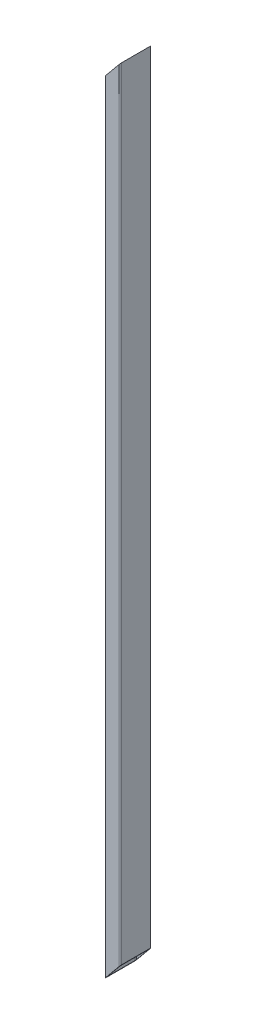
ISO-10303-21;
HEADER;
FILE_DESCRIPTION(('STEP AP214'),'2;1');
FILE_NAME('part.step','',(''),(''),'','','');
FILE_SCHEMA(('AUTOMOTIVE_DESIGN { 1 0 10303 214 1 1 1 1 }'));
ENDSEC;
DATA;
#1=APPLICATION_CONTEXT('core data for automotive mechanical design processes');
#2=APPLICATION_PROTOCOL_DEFINITION('international standard','automotive_design',2000,#1);
#3=PRODUCT_CONTEXT('',#1,'mechanical');
#4=PRODUCT('Part','Part','',(#3));
#5=PRODUCT_RELATED_PRODUCT_CATEGORY('part','',(#4));
#6=PRODUCT_DEFINITION_FORMATION('','',#4);
#7=PRODUCT_DEFINITION_CONTEXT('part definition',#1,'design');
#8=PRODUCT_DEFINITION('design','',#6,#7);
#9=PRODUCT_DEFINITION_SHAPE('','',#8);
#10=(LENGTH_UNIT() NAMED_UNIT(*) SI_UNIT(.MILLI.,.METRE.));
#11=(NAMED_UNIT(*) PLANE_ANGLE_UNIT() SI_UNIT($,.RADIAN.));
#12=(NAMED_UNIT(*) SI_UNIT($,.STERADIAN.) SOLID_ANGLE_UNIT());
#13=UNCERTAINTY_MEASURE_WITH_UNIT(LENGTH_MEASURE(1.E-05),#10,'distance_accuracy_value','');
#14=(GEOMETRIC_REPRESENTATION_CONTEXT(3) GLOBAL_UNCERTAINTY_ASSIGNED_CONTEXT((#13)) GLOBAL_UNIT_ASSIGNED_CONTEXT((#10,
#11,#12)) REPRESENTATION_CONTEXT('',''));
#15=CARTESIAN_POINT('',(0.,0.,0.));
#16=DIRECTION('',(0.,0.,1.));
#17=DIRECTION('',(1.,0.,0.));
#18=AXIS2_PLACEMENT_3D('',#15,#16,#17);
#19=CARTESIAN_POINT('',(-19.5606601717798,1198.48759471742,0.439339828217511));
#20=DIRECTION('',(0.771561366113838,-0.636154901199816,0.));
#21=DIRECTION('',(0.636154901199816,0.771561366113838,0.));
#22=AXIS2_PLACEMENT_3D('',#19,#20,#21);
#23=PLANE('',#22);
#24=CARTESIAN_POINT('',(-18.5,1199.77401789765,-2.66496893996937E-12));
#25=CARTESIAN_POINT('',(-19.3786796564404,1198.70831004125,-2.66981289665576E-12));
#26=CARTESIAN_POINT('',(-20.,1197.95474078922,0.621320343556975));
#27=CARTESIAN_POINT('',(-20.,1197.95474078922,1.49999999999734));
#28=(BOUNDED_CURVE() B_SPLINE_CURVE(3,(#24,#25,#26,#27),.UNSPECIFIED.,.F.,
.F.) B_SPLINE_CURVE_WITH_KNOTS((4,4),(0.,1.),
.UNSPECIFIED.) CURVE() GEOMETRIC_REPRESENTATION_ITEM() RATIONAL_B_SPLINE_CURVE((1.,
0.804737854124364,0.804737854124364,1.)) REPRESENTATION_ITEM(''));
#29=CARTESIAN_POINT('',(-18.4999999999298,1199.77401789759,-2.66270419889708E-12));
#30=VERTEX_POINT('',#29);
#31=CARTESIAN_POINT('',(-20.,1197.95474078907,1.49999999999734));
#32=VERTEX_POINT('',#31);
#33=EDGE_CURVE('E249',#30,#32,#28,.T.);
#34=ORIENTED_EDGE('',*,*,#33,.T.);
#35=DIRECTION('',(0.,0.,-1.));
#36=VECTOR('',#35,1.);
#37=CARTESIAN_POINT('',(-20.,1197.95474078907,-57.9999999999982));
#38=LINE('',#37,#36);
#39=CARTESIAN_POINT('',(-20.,1197.95474078922,38.4999999999973));
#40=VERTEX_POINT('',#39);
#41=EDGE_CURVE('E253',#40,#32,#38,.T.);
#42=ORIENTED_EDGE('',*,*,#41,.F.);
#43=CARTESIAN_POINT('',(-20.,1197.95474078922,38.4999999999973));
#44=CARTESIAN_POINT('',(-20.,1197.95474078922,39.3786796564377));
#45=CARTESIAN_POINT('',(-19.3786796564403,1198.70831004125,39.9999999999973));
#46=CARTESIAN_POINT('',(-18.5,1199.77401789765,39.9999999999973));
#47=(BOUNDED_CURVE() B_SPLINE_CURVE(3,(#43,#44,#45,#46),.UNSPECIFIED.,.F.,
.F.) B_SPLINE_CURVE_WITH_KNOTS((4,4),(0.,1.),
.UNSPECIFIED.) CURVE() GEOMETRIC_REPRESENTATION_ITEM() RATIONAL_B_SPLINE_CURVE((1.,
0.804737854124364,0.804737854124364,1.)) REPRESENTATION_ITEM(''));
#48=CARTESIAN_POINT('',(-18.4999999999298,1199.77401789759,39.9999999999973));
#49=VERTEX_POINT('',#48);
#50=EDGE_CURVE('E260',#40,#49,#47,.T.);
#51=ORIENTED_EDGE('',*,*,#50,.T.);
#52=DIRECTION('',(-0.636154901199819,-0.771561366113836,0.));
#53=VECTOR('',#52,1.);
#54=CARTESIAN_POINT('',(2380.74301047747,4109.69927558504,39.9999999999964));
#55=LINE('',#54,#53);
#56=CARTESIAN_POINT('',(-1.49999999999998,1220.39249179318,39.9999999999973));
#57=VERTEX_POINT('',#56);
#58=EDGE_CURVE('E264',#57,#49,#55,.T.);
#59=ORIENTED_EDGE('',*,*,#58,.F.);
#60=CARTESIAN_POINT('',(-1.49999999999998,1220.39249179318,39.9999999999973));
#61=CARTESIAN_POINT('',(-0.621320343559615,1221.45819964958,39.9999999999973));
#62=CARTESIAN_POINT('',(0.,1222.21176890161,39.3786796564377));
#63=CARTESIAN_POINT('',(0.,1222.21176890161,38.4999999999973));
#64=(BOUNDED_CURVE() B_SPLINE_CURVE(3,(#60,#61,#62,#63),.UNSPECIFIED.,.F.,
.F.) B_SPLINE_CURVE_WITH_KNOTS((4,4),(0.,1.),
.UNSPECIFIED.) CURVE() GEOMETRIC_REPRESENTATION_ITEM() RATIONAL_B_SPLINE_CURVE((1.,
0.804737854124365,0.804737854124365,1.)) REPRESENTATION_ITEM(''));
#65=CARTESIAN_POINT('',(0.,1222.21176890152,38.4999999999973));
#66=VERTEX_POINT('',#65);
#67=EDGE_CURVE('E270',#57,#66,#64,.T.);
#68=ORIENTED_EDGE('',*,*,#67,.T.);
#69=DIRECTION('',(0.,0.,1.));
#70=VECTOR('',#69,1.);
#71=CARTESIAN_POINT('',(0.,1222.21176890152,-57.9999999999977));
#72=LINE('',#71,#70);
#73=CARTESIAN_POINT('',(0.,1222.21176890161,1.49999999999732));
#74=VERTEX_POINT('',#73);
#75=EDGE_CURVE('E274',#74,#66,#72,.T.);
#76=ORIENTED_EDGE('',*,*,#75,.F.);
#77=CARTESIAN_POINT('',(0.,1222.21176890161,1.49999999999732));
#78=CARTESIAN_POINT('',(0.,1222.21176890161,0.621320343556965));
#79=CARTESIAN_POINT('',(-0.621320343559643,1221.45819964958,-2.67868531694287E-12));
#80=CARTESIAN_POINT('',(-1.5,1220.39249179318,-2.67884672777718E-12));
#81=(BOUNDED_CURVE() B_SPLINE_CURVE(3,(#77,#78,#79,#80),.UNSPECIFIED.,.F.,
.F.) B_SPLINE_CURVE_WITH_KNOTS((4,4),(0.,1.),
.UNSPECIFIED.) CURVE() GEOMETRIC_REPRESENTATION_ITEM() RATIONAL_B_SPLINE_CURVE((1.,
0.804737854124365,0.804737854124365,1.)) REPRESENTATION_ITEM(''));
#82=CARTESIAN_POINT('',(-1.49999999995831,1220.39249179314,-2.67658198670487E-12));
#83=VERTEX_POINT('',#82);
#84=EDGE_CURVE('E280',#74,#83,#81,.T.);
#85=ORIENTED_EDGE('',*,*,#84,.T.);
#86=DIRECTION('',(0.636154901199819,0.771561366113836,0.));
#87=VECTOR('',#86,1.);
#88=CARTESIAN_POINT('',(2380.74301047747,4109.69927558504,-4.62130334000221E-12));
#89=LINE('',#88,#87);
#90=EDGE_CURVE('E284',#30,#83,#89,.T.);
#91=ORIENTED_EDGE('',*,*,#90,.F.);
#92=EDGE_LOOP('',(#34,#42,#51,#59,#68,#76,#85,#91));
#93=FACE_BOUND('',#92,.T.);
#94=CARTESIAN_POINT('',(-1.5,1220.39249179306,2.49999999999732));
#95=CARTESIAN_POINT('',(-1.5,1220.39249179306,1.91421356237042));
#96=CARTESIAN_POINT('',(-1.9142135623731,1219.89011229171,1.49999999999733));
#97=CARTESIAN_POINT('',(-2.5,1219.17964038744,1.49999999999733));
#98=(BOUNDED_CURVE() B_SPLINE_CURVE(3,(#94,#95,#96,#97),.UNSPECIFIED.,.F.,
.F.) B_SPLINE_CURVE_WITH_KNOTS((4,4),(0.,1.),
.UNSPECIFIED.) CURVE() GEOMETRIC_REPRESENTATION_ITEM() RATIONAL_B_SPLINE_CURVE((1.,
0.804737854124365,0.804737854124365,1.)) REPRESENTATION_ITEM(''));
#99=CARTESIAN_POINT('',(-1.5,1220.39249179309,2.49999999999732));
#100=VERTEX_POINT('',#99);
#101=CARTESIAN_POINT('',(-2.50000000001549,1219.17964038745,1.49999999999732));
#102=VERTEX_POINT('',#101);
#103=EDGE_CURVE('E146',#100,#102,#98,.T.);
#104=ORIENTED_EDGE('',*,*,#103,.F.);
#105=DIRECTION('',(0.,0.,1.));
#106=VECTOR('',#105,1.);
#107=CARTESIAN_POINT('',(-1.50000000000006,1220.39249179309,-57.9999999999974));
#108=LINE('',#107,#106);
#109=CARTESIAN_POINT('',(-1.49999999999997,1220.39249179324,37.4999999999973));
#110=VERTEX_POINT('',#109);
#111=EDGE_CURVE('E195',#100,#110,#108,.T.);
#112=ORIENTED_EDGE('',*,*,#111,.T.);
#113=CARTESIAN_POINT('',(-2.49999999999998,1219.17964038744,38.4999999999973));
#114=CARTESIAN_POINT('',(-1.91421356237307,1219.89011229171,38.4999999999973));
#115=CARTESIAN_POINT('',(-1.49999999999998,1220.39249179306,38.0857864376242));
#116=CARTESIAN_POINT('',(-1.49999999999998,1220.39249179306,37.4999999999973));
#117=(BOUNDED_CURVE() B_SPLINE_CURVE(3,(#113,#114,#115,#116),.UNSPECIFIED.,.F.,
.F.) B_SPLINE_CURVE_WITH_KNOTS((4,4),(0.,1.),
.UNSPECIFIED.) CURVE() GEOMETRIC_REPRESENTATION_ITEM() RATIONAL_B_SPLINE_CURVE((1.,
0.804737854124365,0.804737854124365,1.)) REPRESENTATION_ITEM(''));
#118=CARTESIAN_POINT('',(-2.49999999999998,1219.17964038744,38.4999999999973));
#119=VERTEX_POINT('',#118);
#120=EDGE_CURVE('E191',#119,#110,#117,.T.);
#121=ORIENTED_EDGE('',*,*,#120,.F.);
#122=DIRECTION('',(-0.636154901199819,-0.771561366113836,0.));
#123=VECTOR('',#122,1.);
#124=CARTESIAN_POINT('',(2380.74301047747,4109.69927558504,38.4999999999951));
#125=LINE('',#124,#123);
#126=CARTESIAN_POINT('',(-17.4999999999841,1200.98686930315,38.4999999999973));
#127=VERTEX_POINT('',#126);
#128=EDGE_CURVE('E185',#119,#127,#125,.T.);
#129=ORIENTED_EDGE('',*,*,#128,.T.);
#130=CARTESIAN_POINT('',(-18.5,1199.77401789754,37.4999999999973));
#131=CARTESIAN_POINT('',(-18.5,1199.77401789754,38.0857864376242));
#132=CARTESIAN_POINT('',(-18.0857864376269,1200.27639739889,38.4999999999973));
#133=CARTESIAN_POINT('',(-17.5,1200.98686930316,38.4999999999973));
#134=(BOUNDED_CURVE() B_SPLINE_CURVE(3,(#130,#131,#132,#133),.UNSPECIFIED.,.F.,
.F.) B_SPLINE_CURVE_WITH_KNOTS((4,4),(0.,1.),
.UNSPECIFIED.) CURVE() GEOMETRIC_REPRESENTATION_ITEM() RATIONAL_B_SPLINE_CURVE((1.,
0.804737854124365,0.804737854124365,1.)) REPRESENTATION_ITEM(''));
#135=CARTESIAN_POINT('',(-18.5,1199.77401789754,37.4999999999973));
#136=VERTEX_POINT('',#135);
#137=EDGE_CURVE('E181',#136,#127,#134,.T.);
#138=ORIENTED_EDGE('',*,*,#137,.F.);
#139=DIRECTION('',(0.,0.,-1.));
#140=VECTOR('',#139,1.);
#141=CARTESIAN_POINT('',(-18.5,1199.77401789751,-57.9999999999986));
#142=LINE('',#141,#140);
#143=CARTESIAN_POINT('',(-18.4999999999999,1199.77401789751,2.49999999999734));
#144=VERTEX_POINT('',#143);
#145=EDGE_CURVE('E170',#136,#144,#142,.T.);
#146=ORIENTED_EDGE('',*,*,#145,.T.);
#147=CARTESIAN_POINT('',(-17.5,1200.98686930316,1.49999999999734));
#148=CARTESIAN_POINT('',(-18.0857864376269,1200.27639739889,1.49999999999734));
#149=CARTESIAN_POINT('',(-18.5,1199.77401789754,1.91421356237044));
#150=CARTESIAN_POINT('',(-18.5,1199.77401789754,2.49999999999734));
#151=(BOUNDED_CURVE() B_SPLINE_CURVE(3,(#147,#148,#149,#150),.UNSPECIFIED.,.F.,
.F.) B_SPLINE_CURVE_WITH_KNOTS((4,4),(0.,1.),
.UNSPECIFIED.) CURVE() GEOMETRIC_REPRESENTATION_ITEM() RATIONAL_B_SPLINE_CURVE((1.,
0.804737854124365,0.804737854124365,1.)) REPRESENTATION_ITEM(''));
#152=CARTESIAN_POINT('',(-17.5,1200.98686930316,1.49999999999734));
#153=VERTEX_POINT('',#152);
#154=EDGE_CURVE('E168',#153,#144,#151,.T.);
#155=ORIENTED_EDGE('',*,*,#154,.F.);
#156=DIRECTION('',(0.636154901199819,0.771561366113836,0.));
#157=VECTOR('',#156,1.);
#158=CARTESIAN_POINT('',(2380.74301047747,4109.69927558504,1.49999999999291));
#159=LINE('',#158,#157);
#160=EDGE_CURVE('E155',#153,#102,#159,.T.);
#161=ORIENTED_EDGE('',*,*,#160,.T.);
#162=EDGE_LOOP('',(#104,#112,#121,#129,#138,#146,#155,#161));
#163=FACE_BOUND('',#162,.T.);
#164=ADVANCED_FACE('F35',(#93,#163),#23,.F.);
#165=CARTESIAN_POINT('',(-19.5606601717798,198.487594717422,0.439339828217511));
#166=DIRECTION('',(0.771561366113838,-0.636154901199816,0.));
#167=DIRECTION('',(0.636154901199816,0.771561366113838,0.));
#168=AXIS2_PLACEMENT_3D('',#165,#166,#167);
#169=PLANE('',#168);
#170=CARTESIAN_POINT('',(-18.5,199.774017897653,-2.66496893996937E-12));
#171=CARTESIAN_POINT('',(-19.3786796564404,198.708310041247,-2.66981289665576E-12));
#172=CARTESIAN_POINT('',(-20.,197.954740789219,0.621320343556975));
#173=CARTESIAN_POINT('',(-20.,197.954740789219,1.49999999999734));
#174=(BOUNDED_CURVE() B_SPLINE_CURVE(3,(#170,#171,#172,#173),.UNSPECIFIED.,.F.,
.F.) B_SPLINE_CURVE_WITH_KNOTS((4,4),(0.,1.),
.UNSPECIFIED.) CURVE() GEOMETRIC_REPRESENTATION_ITEM() RATIONAL_B_SPLINE_CURVE((1.,
0.804737854124364,0.804737854124364,1.)) REPRESENTATION_ITEM(''));
#175=CARTESIAN_POINT('',(-18.4999999999298,199.774017897593,-2.66270419889708E-12));
#176=VERTEX_POINT('',#175);
#177=CARTESIAN_POINT('',(-20.,197.954740789075,1.49999999999734));
#178=VERTEX_POINT('',#177);
#179=EDGE_CURVE('E164',#176,#178,#174,.T.);
#180=ORIENTED_EDGE('',*,*,#179,.F.);
#181=DIRECTION('',(0.636154901199819,0.771561366113836,0.));
#182=VECTOR('',#181,1.);
#183=CARTESIAN_POINT('',(2380.74301047747,3109.69927558504,-4.62130334000221E-12));
#184=LINE('',#183,#182);
#185=CARTESIAN_POINT('',(-1.49999999995831,220.392491793141,-2.67658198670487E-12));
#186=VERTEX_POINT('',#185);
#187=EDGE_CURVE('E254',#176,#186,#184,.T.);
#188=ORIENTED_EDGE('',*,*,#187,.T.);
#189=CARTESIAN_POINT('',(0.,222.211768901611,1.49999999999732));
#190=CARTESIAN_POINT('',(0.,222.211768901611,0.621320343556965));
#191=CARTESIAN_POINT('',(-0.621320343559643,221.458199649583,-2.67868531694287E-12));
#192=CARTESIAN_POINT('',(-1.5,220.392491793177,-2.67884672777718E-12));
#193=(BOUNDED_CURVE() B_SPLINE_CURVE(3,(#189,#190,#191,#192),.UNSPECIFIED.,.F.,
.F.) B_SPLINE_CURVE_WITH_KNOTS((4,4),(0.,1.),
.UNSPECIFIED.) CURVE() GEOMETRIC_REPRESENTATION_ITEM() RATIONAL_B_SPLINE_CURVE((1.,
0.804737854124365,0.804737854124365,1.)) REPRESENTATION_ITEM(''));
#194=CARTESIAN_POINT('',(0.,222.211768901611,1.49999999999732));
#195=VERTEX_POINT('',#194);
#196=EDGE_CURVE('E323',#195,#186,#193,.T.);
#197=ORIENTED_EDGE('',*,*,#196,.F.);
#198=DIRECTION('',(0.,0.,1.));
#199=VECTOR('',#198,1.);
#200=CARTESIAN_POINT('',(0.,222.211768901524,-57.9999999999977));
#201=LINE('',#200,#199);
#202=CARTESIAN_POINT('',(0.,222.211768901524,38.4999999999973));
#203=VERTEX_POINT('',#202);
#204=EDGE_CURVE('E317',#195,#203,#201,.T.);
#205=ORIENTED_EDGE('',*,*,#204,.T.);
#206=CARTESIAN_POINT('',(-1.49999999999998,220.392491793177,39.9999999999973));
#207=CARTESIAN_POINT('',(-0.621320343559615,221.458199649583,39.9999999999973));
#208=CARTESIAN_POINT('',(0.,222.211768901611,39.3786796564377));
#209=CARTESIAN_POINT('',(0.,222.211768901611,38.4999999999973));
#210=(BOUNDED_CURVE() B_SPLINE_CURVE(3,(#206,#207,#208,#209),.UNSPECIFIED.,.F.,
.F.) B_SPLINE_CURVE_WITH_KNOTS((4,4),(0.,1.),
.UNSPECIFIED.) CURVE() GEOMETRIC_REPRESENTATION_ITEM() RATIONAL_B_SPLINE_CURVE((1.,
0.804737854124365,0.804737854124365,1.)) REPRESENTATION_ITEM(''));
#211=CARTESIAN_POINT('',(-1.49999999999998,220.392491793177,39.9999999999973));
#212=VERTEX_POINT('',#211);
#213=EDGE_CURVE('E312',#212,#203,#210,.T.);
#214=ORIENTED_EDGE('',*,*,#213,.F.);
#215=DIRECTION('',(-0.636154901199819,-0.771561366113836,0.));
#216=VECTOR('',#215,1.);
#217=CARTESIAN_POINT('',(2380.74301047747,3109.69927558504,39.9999999999964));
#218=LINE('',#217,#216);
#219=CARTESIAN_POINT('',(-18.4999999999298,199.774017897593,39.9999999999973));
#220=VERTEX_POINT('',#219);
#221=EDGE_CURVE('E306',#212,#220,#218,.T.);
#222=ORIENTED_EDGE('',*,*,#221,.T.);
#223=CARTESIAN_POINT('',(-20.,197.954740789219,38.4999999999973));
#224=CARTESIAN_POINT('',(-20.,197.954740789219,39.3786796564377));
#225=CARTESIAN_POINT('',(-19.3786796564403,198.708310041247,39.9999999999973));
#226=CARTESIAN_POINT('',(-18.5,199.774017897653,39.9999999999973));
#227=(BOUNDED_CURVE() B_SPLINE_CURVE(3,(#223,#224,#225,#226),.UNSPECIFIED.,.F.,
.F.) B_SPLINE_CURVE_WITH_KNOTS((4,4),(0.,1.),
.UNSPECIFIED.) CURVE() GEOMETRIC_REPRESENTATION_ITEM() RATIONAL_B_SPLINE_CURVE((1.,
0.804737854124364,0.804737854124364,1.)) REPRESENTATION_ITEM(''));
#228=CARTESIAN_POINT('',(-20.,197.954740789219,38.4999999999973));
#229=VERTEX_POINT('',#228);
#230=EDGE_CURVE('E301',#229,#220,#227,.T.);
#231=ORIENTED_EDGE('',*,*,#230,.F.);
#232=DIRECTION('',(0.,0.,-1.));
#233=VECTOR('',#232,1.);
#234=CARTESIAN_POINT('',(-20.,197.954740789075,-57.9999999999982));
#235=LINE('',#234,#233);
#236=EDGE_CURVE('E295',#229,#178,#235,.T.);
#237=ORIENTED_EDGE('',*,*,#236,.T.);
#238=EDGE_LOOP('',(#180,#188,#197,#205,#214,#222,#231,#237));
#239=FACE_BOUND('',#238,.T.);
#240=DIRECTION('',(0.,0.,1.));
#241=VECTOR('',#240,1.);
#242=CARTESIAN_POINT('',(-1.50000000000006,220.392491793091,-57.9999999999974));
#243=LINE('',#242,#241);
#244=CARTESIAN_POINT('',(-1.5,220.392491793235,2.49999999999732));
#245=VERTEX_POINT('',#244);
#246=CARTESIAN_POINT('',(-1.49999999999997,220.392491793091,37.4999999999973));
#247=VERTEX_POINT('',#246);
#248=EDGE_CURVE('E156',#245,#247,#243,.T.);
#249=ORIENTED_EDGE('',*,*,#248,.F.);
#250=CARTESIAN_POINT('',(-1.5,220.39249179306,2.49999999999732));
#251=CARTESIAN_POINT('',(-1.5,220.39249179306,1.91421356237042));
#252=CARTESIAN_POINT('',(-1.9142135623731,219.890112291708,1.49999999999733));
#253=CARTESIAN_POINT('',(-2.5,219.179640387438,1.49999999999733));
#254=(BOUNDED_CURVE() B_SPLINE_CURVE(3,(#250,#251,#252,#253),.UNSPECIFIED.,.F.,
.F.) B_SPLINE_CURVE_WITH_KNOTS((4,4),(0.,1.),
.UNSPECIFIED.) CURVE() GEOMETRIC_REPRESENTATION_ITEM() RATIONAL_B_SPLINE_CURVE((1.,
0.804737854124365,0.804737854124365,1.)) REPRESENTATION_ITEM(''));
#255=CARTESIAN_POINT('',(-2.50000000001549,219.17964038745,1.49999999999732));
#256=VERTEX_POINT('',#255);
#257=EDGE_CURVE('E58',#245,#256,#254,.T.);
#258=ORIENTED_EDGE('',*,*,#257,.T.);
#259=DIRECTION('',(0.636154901199819,0.771561366113836,0.));
#260=VECTOR('',#259,1.);
#261=CARTESIAN_POINT('',(2380.74301047747,3109.69927558504,1.49999999999291));
#262=LINE('',#261,#260);
#263=CARTESIAN_POINT('',(-17.5,200.986869303165,1.49999999999734));
#264=VERTEX_POINT('',#263);
#265=EDGE_CURVE('E163',#264,#256,#262,.T.);
#266=ORIENTED_EDGE('',*,*,#265,.F.);
#267=CARTESIAN_POINT('',(-17.5,200.986869303165,1.49999999999734));
#268=CARTESIAN_POINT('',(-18.0857864376269,200.276397398895,1.49999999999734));
#269=CARTESIAN_POINT('',(-18.5,199.774017897542,1.91421356237044));
#270=CARTESIAN_POINT('',(-18.5,199.774017897542,2.49999999999734));
#271=(BOUNDED_CURVE() B_SPLINE_CURVE(3,(#267,#268,#269,#270),.UNSPECIFIED.,.F.,
.F.) B_SPLINE_CURVE_WITH_KNOTS((4,4),(0.,1.),
.UNSPECIFIED.) CURVE() GEOMETRIC_REPRESENTATION_ITEM() RATIONAL_B_SPLINE_CURVE((1.,
0.804737854124365,0.804737854124365,1.)) REPRESENTATION_ITEM(''));
#272=CARTESIAN_POINT('',(-18.4999999999999,199.774017897509,2.49999999999734));
#273=VERTEX_POINT('',#272);
#274=EDGE_CURVE('E207',#264,#273,#271,.T.);
#275=ORIENTED_EDGE('',*,*,#274,.T.);
#276=DIRECTION('',(0.,0.,-1.));
#277=VECTOR('',#276,1.);
#278=CARTESIAN_POINT('',(-18.5,199.774017897508,-57.9999999999986));
#279=LINE('',#278,#277);
#280=CARTESIAN_POINT('',(-18.5,199.774017897542,37.4999999999973));
#281=VERTEX_POINT('',#280);
#282=EDGE_CURVE('E212',#281,#273,#279,.T.);
#283=ORIENTED_EDGE('',*,*,#282,.F.);
#284=CARTESIAN_POINT('',(-18.5,199.774017897542,37.4999999999973));
#285=CARTESIAN_POINT('',(-18.5,199.774017897542,38.0857864376242));
#286=CARTESIAN_POINT('',(-18.0857864376269,200.276397398894,38.4999999999973));
#287=CARTESIAN_POINT('',(-17.5,200.986869303165,38.4999999999973));
#288=(BOUNDED_CURVE() B_SPLINE_CURVE(3,(#284,#285,#286,#287),.UNSPECIFIED.,.F.,
.F.) B_SPLINE_CURVE_WITH_KNOTS((4,4),(0.,1.),
.UNSPECIFIED.) CURVE() GEOMETRIC_REPRESENTATION_ITEM() RATIONAL_B_SPLINE_CURVE((1.,
0.804737854124365,0.804737854124365,1.)) REPRESENTATION_ITEM(''));
#289=CARTESIAN_POINT('',(-17.4999999999841,200.98686930315,38.4999999999973));
#290=VERTEX_POINT('',#289);
#291=EDGE_CURVE('E218',#281,#290,#288,.T.);
#292=ORIENTED_EDGE('',*,*,#291,.T.);
#293=DIRECTION('',(-0.636154901199819,-0.771561366113836,0.));
#294=VECTOR('',#293,1.);
#295=CARTESIAN_POINT('',(2380.74301047747,3109.69927558504,38.4999999999951));
#296=LINE('',#295,#294);
#297=CARTESIAN_POINT('',(-2.49999999999998,219.179640387438,38.4999999999973));
#298=VERTEX_POINT('',#297);
#299=EDGE_CURVE('E223',#298,#290,#296,.T.);
#300=ORIENTED_EDGE('',*,*,#299,.F.);
#301=CARTESIAN_POINT('',(-2.49999999999998,219.179640387438,38.4999999999973));
#302=CARTESIAN_POINT('',(-1.91421356237307,219.890112291708,38.4999999999973));
#303=CARTESIAN_POINT('',(-1.49999999999998,220.39249179306,38.0857864376242));
#304=CARTESIAN_POINT('',(-1.49999999999998,220.39249179306,37.4999999999973));
#305=(BOUNDED_CURVE() B_SPLINE_CURVE(3,(#301,#302,#303,#304),.UNSPECIFIED.,.F.,
.F.) B_SPLINE_CURVE_WITH_KNOTS((4,4),(0.,1.),
.UNSPECIFIED.) CURVE() GEOMETRIC_REPRESENTATION_ITEM() RATIONAL_B_SPLINE_CURVE((1.,
0.804737854124365,0.804737854124365,1.)) REPRESENTATION_ITEM(''));
#306=EDGE_CURVE('E229',#298,#247,#305,.T.);
#307=ORIENTED_EDGE('',*,*,#306,.T.);
#308=EDGE_LOOP('',(#249,#258,#266,#275,#283,#292,#300,#307));
#309=FACE_BOUND('',#308,.T.);
#310=ADVANCED_FACE('F353',(#239,#309),#169,.T.);
#311=CARTESIAN_POINT('',(-18.5,1199.77401789759,1.49999999999733));
#312=DIRECTION('',(0.,-1.,0.));
#313=DIRECTION('',(0.,0.,-1.));
#314=AXIS2_PLACEMENT_3D('',#311,#312,#313);
#315=CYLINDRICAL_SURFACE('',#314,1.5);
#316=ORIENTED_EDGE('',*,*,#179,.T.);
#317=DIRECTION('',(0.,-1.,0.));
#318=VECTOR('',#317,1.);
#319=CARTESIAN_POINT('',(-20.,1197.95474078907,1.49999999999734));
#320=LINE('',#319,#318);
#321=EDGE_CURVE('E11',#32,#178,#320,.T.);
#322=ORIENTED_EDGE('',*,*,#321,.F.);
#323=ORIENTED_EDGE('',*,*,#33,.F.);
#324=DIRECTION('',(0.,-1.,0.));
#325=VECTOR('',#324,1.);
#326=CARTESIAN_POINT('',(-18.4999999999298,1199.77401789759,-2.66270419889708E-12));
#327=LINE('',#326,#325);
#328=EDGE_CURVE('E290',#30,#176,#327,.T.);
#329=ORIENTED_EDGE('',*,*,#328,.T.);
#330=EDGE_LOOP('',(#316,#322,#323,#329));
#331=FACE_BOUND('',#330,.T.);
#332=ADVANCED_FACE('F37',(#331),#315,.T.);
#333=CARTESIAN_POINT('',(-20.,1197.95474078907,-57.9999999999982));
#334=DIRECTION('',(-1.,0.,0.));
#335=DIRECTION('',(0.,0.,1.));
#336=AXIS2_PLACEMENT_3D('',#333,#334,#335);
#337=PLANE('',#336);
#338=ORIENTED_EDGE('',*,*,#236,.F.);
#339=DIRECTION('',(0.,-1.,0.));
#340=VECTOR('',#339,1.);
#341=CARTESIAN_POINT('',(-20.,1197.95474078922,38.4999999999973));
#342=LINE('',#341,#340);
#343=EDGE_CURVE('E43',#40,#229,#342,.T.);
#344=ORIENTED_EDGE('',*,*,#343,.F.);
#345=ORIENTED_EDGE('',*,*,#41,.T.);
#346=ORIENTED_EDGE('',*,*,#321,.T.);
#347=EDGE_LOOP('',(#338,#344,#345,#346));
#348=FACE_BOUND('',#347,.T.);
#349=ADVANCED_FACE('F357',(#348),#337,.T.);
#350=CARTESIAN_POINT('',(-18.5,1197.95474078922,38.4999999999973));
#351=DIRECTION('',(0.,-1.,0.));
#352=DIRECTION('',(0.,0.,-1.));
#353=AXIS2_PLACEMENT_3D('',#350,#351,#352);
#354=CYLINDRICAL_SURFACE('',#353,1.5);
#355=ORIENTED_EDGE('',*,*,#230,.T.);
#356=DIRECTION('',(0.,-1.,0.));
#357=VECTOR('',#356,1.);
#358=CARTESIAN_POINT('',(-18.4999999999298,1199.77401789759,39.9999999999973));
#359=LINE('',#358,#357);
#360=EDGE_CURVE('E342',#49,#220,#359,.T.);
#361=ORIENTED_EDGE('',*,*,#360,.F.);
#362=ORIENTED_EDGE('',*,*,#50,.F.);
#363=ORIENTED_EDGE('',*,*,#343,.T.);
#364=EDGE_LOOP('',(#355,#361,#362,#363));
#365=FACE_BOUND('',#364,.T.);
#366=ADVANCED_FACE('F346',(#365),#354,.T.);
#367=CARTESIAN_POINT('',(2380.74301047747,4109.69927558504,39.9999999999964));
#368=DIRECTION('',(0.,0.,1.));
#369=DIRECTION('',(1.,0.,0.));
#370=AXIS2_PLACEMENT_3D('',#367,#368,#369);
#371=PLANE('',#370);
#372=ORIENTED_EDGE('',*,*,#221,.F.);
#373=DIRECTION('',(0.,-1.,0.));
#374=VECTOR('',#373,1.);
#375=CARTESIAN_POINT('',(-1.49999999999998,1220.39249179318,39.9999999999973));
#376=LINE('',#375,#374);
#377=EDGE_CURVE('E340',#57,#212,#376,.T.);
#378=ORIENTED_EDGE('',*,*,#377,.F.);
#379=ORIENTED_EDGE('',*,*,#58,.T.);
#380=ORIENTED_EDGE('',*,*,#360,.T.);
#381=EDGE_LOOP('',(#372,#378,#379,#380));
#382=FACE_BOUND('',#381,.T.);
#383=ADVANCED_FACE('F379',(#382),#371,.T.);
#384=CARTESIAN_POINT('',(-1.49999999999998,1220.39249179318,38.4999999999973));
#385=DIRECTION('',(0.,-1.,0.));
#386=DIRECTION('',(0.,0.,-1.));
#387=AXIS2_PLACEMENT_3D('',#384,#385,#386);
#388=CYLINDRICAL_SURFACE('',#387,1.50000000000001);
#389=ORIENTED_EDGE('',*,*,#213,.T.);
#390=DIRECTION('',(0.,-1.,0.));
#391=VECTOR('',#390,1.);
#392=CARTESIAN_POINT('',(0.,1222.21176890152,38.4999999999973));
#393=LINE('',#392,#391);
#394=EDGE_CURVE('E338',#66,#203,#393,.T.);
#395=ORIENTED_EDGE('',*,*,#394,.F.);
#396=ORIENTED_EDGE('',*,*,#67,.F.);
#397=ORIENTED_EDGE('',*,*,#377,.T.);
#398=EDGE_LOOP('',(#389,#395,#396,#397));
#399=FACE_BOUND('',#398,.T.);
#400=ADVANCED_FACE('F377',(#399),#388,.T.);
#401=CARTESIAN_POINT('',(0.,1222.21176890152,-57.9999999999977));
#402=DIRECTION('',(1.,0.,0.));
#403=DIRECTION('',(0.,0.,-1.));
#404=AXIS2_PLACEMENT_3D('',#401,#402,#403);
#405=PLANE('',#404);
#406=ORIENTED_EDGE('',*,*,#204,.F.);
#407=DIRECTION('',(0.,-1.,0.));
#408=VECTOR('',#407,1.);
#409=CARTESIAN_POINT('',(0.,1222.21176890161,1.49999999999732));
#410=LINE('',#409,#408);
#411=EDGE_CURVE('E336',#74,#195,#410,.T.);
#412=ORIENTED_EDGE('',*,*,#411,.F.);
#413=ORIENTED_EDGE('',*,*,#75,.T.);
#414=ORIENTED_EDGE('',*,*,#394,.T.);
#415=EDGE_LOOP('',(#406,#412,#413,#414));
#416=FACE_BOUND('',#415,.T.);
#417=ADVANCED_FACE('F372',(#416),#405,.T.);
#418=CARTESIAN_POINT('',(-1.5,1222.21176890161,1.49999999999732));
#419=DIRECTION('',(0.,-1.,0.));
#420=DIRECTION('',(0.,0.,-1.));
#421=AXIS2_PLACEMENT_3D('',#418,#419,#420);
#422=CYLINDRICAL_SURFACE('',#421,1.5);
#423=ORIENTED_EDGE('',*,*,#196,.T.);
#424=DIRECTION('',(0.,-1.,0.));
#425=VECTOR('',#424,1.);
#426=CARTESIAN_POINT('',(-1.49999999995831,1220.39249179314,-2.67658198670487E-12));
#427=LINE('',#426,#425);
#428=EDGE_CURVE('E334',#83,#186,#427,.T.);
#429=ORIENTED_EDGE('',*,*,#428,.F.);
#430=ORIENTED_EDGE('',*,*,#84,.F.);
#431=ORIENTED_EDGE('',*,*,#411,.T.);
#432=EDGE_LOOP('',(#423,#429,#430,#431));
#433=FACE_BOUND('',#432,.T.);
#434=ADVANCED_FACE('F369',(#433),#422,.T.);
#435=CARTESIAN_POINT('',(2380.74301047747,4109.69927558504,-4.62130334000221E-12));
#436=DIRECTION('',(0.,0.,-1.));
#437=DIRECTION('',(-1.,0.,0.));
#438=AXIS2_PLACEMENT_3D('',#435,#436,#437);
#439=PLANE('',#438);
#440=ORIENTED_EDGE('',*,*,#187,.F.);
#441=ORIENTED_EDGE('',*,*,#328,.F.);
#442=ORIENTED_EDGE('',*,*,#90,.T.);
#443=ORIENTED_EDGE('',*,*,#428,.T.);
#444=EDGE_LOOP('',(#440,#441,#442,#443));
#445=FACE_BOUND('',#444,.T.);
#446=ADVANCED_FACE('F364',(#445),#439,.T.);
#447=CARTESIAN_POINT('',(-2.5,1220.39249179309,2.49999999999732));
#448=DIRECTION('',(0.,-1.,0.));
#449=DIRECTION('',(0.,0.,-1.));
#450=AXIS2_PLACEMENT_3D('',#447,#448,#449);
#451=CYLINDRICAL_SURFACE('',#450,0.999999999999997);
#452=ORIENTED_EDGE('',*,*,#257,.F.);
#453=DIRECTION('',(0.,-1.,0.));
#454=VECTOR('',#453,1.);
#455=CARTESIAN_POINT('',(-1.5,1220.39249179309,2.49999999999732));
#456=LINE('',#455,#454);
#457=EDGE_CURVE('E151',#100,#245,#456,.T.);
#458=ORIENTED_EDGE('',*,*,#457,.F.);
#459=ORIENTED_EDGE('',*,*,#103,.T.);
#460=DIRECTION('',(0.,-1.,0.));
#461=VECTOR('',#460,1.);
#462=CARTESIAN_POINT('',(-2.50000000001549,1219.17964038745,1.49999999999732));
#463=LINE('',#462,#461);
#464=EDGE_CURVE('E149',#102,#256,#463,.T.);
#465=ORIENTED_EDGE('',*,*,#464,.T.);
#466=EDGE_LOOP('',(#452,#458,#459,#465));
#467=FACE_BOUND('',#466,.T.);
#468=ADVANCED_FACE('F148',(#467),#451,.F.);
#469=CARTESIAN_POINT('',(2380.74301047747,4109.69927558504,1.49999999999291));
#470=DIRECTION('',(0.,0.,-1.));
#471=DIRECTION('',(-1.,0.,0.));
#472=AXIS2_PLACEMENT_3D('',#469,#470,#471);
#473=PLANE('',#472);
#474=ORIENTED_EDGE('',*,*,#265,.T.);
#475=ORIENTED_EDGE('',*,*,#464,.F.);
#476=ORIENTED_EDGE('',*,*,#160,.F.);
#477=DIRECTION('',(0.,-1.,0.));
#478=VECTOR('',#477,1.);
#479=CARTESIAN_POINT('',(-17.5,1200.98686930316,1.49999999999734));
#480=LINE('',#479,#478);
#481=EDGE_CURVE('E165',#153,#264,#480,.T.);
#482=ORIENTED_EDGE('',*,*,#481,.T.);
#483=EDGE_LOOP('',(#474,#475,#476,#482));
#484=FACE_BOUND('',#483,.T.);
#485=ADVANCED_FACE('F160',(#484),#473,.F.);
#486=CARTESIAN_POINT('',(-17.5,1200.98686930316,2.49999999999734));
#487=DIRECTION('',(0.,-1.,0.));
#488=DIRECTION('',(0.,0.,-1.));
#489=AXIS2_PLACEMENT_3D('',#486,#487,#488);
#490=CYLINDRICAL_SURFACE('',#489,0.999999999999997);
#491=ORIENTED_EDGE('',*,*,#274,.F.);
#492=ORIENTED_EDGE('',*,*,#481,.F.);
#493=ORIENTED_EDGE('',*,*,#154,.T.);
#494=DIRECTION('',(0.,-1.,0.));
#495=VECTOR('',#494,1.);
#496=CARTESIAN_POINT('',(-18.4999999999999,1199.77401789751,2.49999999999734));
#497=LINE('',#496,#495);
#498=EDGE_CURVE('E246',#144,#273,#497,.T.);
#499=ORIENTED_EDGE('',*,*,#498,.T.);
#500=EDGE_LOOP('',(#491,#492,#493,#499));
#501=FACE_BOUND('',#500,.T.);
#502=ADVANCED_FACE('F468',(#501),#490,.F.);
#503=CARTESIAN_POINT('',(-18.5,1199.77401789751,-57.9999999999986));
#504=DIRECTION('',(-1.,0.,0.));
#505=DIRECTION('',(0.,0.,1.));
#506=AXIS2_PLACEMENT_3D('',#503,#504,#505);
#507=PLANE('',#506);
#508=ORIENTED_EDGE('',*,*,#282,.T.);
#509=ORIENTED_EDGE('',*,*,#498,.F.);
#510=ORIENTED_EDGE('',*,*,#145,.F.);
#511=DIRECTION('',(0.,-1.,0.));
#512=VECTOR('',#511,1.);
#513=CARTESIAN_POINT('',(-18.5,1199.77401789754,37.4999999999973));
#514=LINE('',#513,#512);
#515=EDGE_CURVE('E244',#136,#281,#514,.T.);
#516=ORIENTED_EDGE('',*,*,#515,.T.);
#517=EDGE_LOOP('',(#508,#509,#510,#516));
#518=FACE_BOUND('',#517,.T.);
#519=ADVANCED_FACE('F475',(#518),#507,.F.);
#520=CARTESIAN_POINT('',(-17.5,1199.77401789754,37.4999999999973));
#521=DIRECTION('',(0.,-1.,0.));
#522=DIRECTION('',(0.,0.,-1.));
#523=AXIS2_PLACEMENT_3D('',#520,#521,#522);
#524=CYLINDRICAL_SURFACE('',#523,1.00000000000001);
#525=ORIENTED_EDGE('',*,*,#291,.F.);
#526=ORIENTED_EDGE('',*,*,#515,.F.);
#527=ORIENTED_EDGE('',*,*,#137,.T.);
#528=DIRECTION('',(0.,-1.,0.));
#529=VECTOR('',#528,1.);
#530=CARTESIAN_POINT('',(-17.4999999999841,1200.98686930315,38.4999999999973));
#531=LINE('',#530,#529);
#532=EDGE_CURVE('E242',#127,#290,#531,.T.);
#533=ORIENTED_EDGE('',*,*,#532,.T.);
#534=EDGE_LOOP('',(#525,#526,#527,#533));
#535=FACE_BOUND('',#534,.T.);
#536=ADVANCED_FACE('F484',(#535),#524,.F.);
#537=CARTESIAN_POINT('',(2380.74301047747,4109.69927558504,38.4999999999951));
#538=DIRECTION('',(0.,0.,1.));
#539=DIRECTION('',(1.,0.,0.));
#540=AXIS2_PLACEMENT_3D('',#537,#538,#539);
#541=PLANE('',#540);
#542=ORIENTED_EDGE('',*,*,#299,.T.);
#543=ORIENTED_EDGE('',*,*,#532,.F.);
#544=ORIENTED_EDGE('',*,*,#128,.F.);
#545=DIRECTION('',(0.,-1.,0.));
#546=VECTOR('',#545,1.);
#547=CARTESIAN_POINT('',(-2.49999999999998,1219.17964038744,38.4999999999973));
#548=LINE('',#547,#546);
#549=EDGE_CURVE('E240',#119,#298,#548,.T.);
#550=ORIENTED_EDGE('',*,*,#549,.T.);
#551=EDGE_LOOP('',(#542,#543,#544,#550));
#552=FACE_BOUND('',#551,.T.);
#553=ADVANCED_FACE('F493',(#552),#541,.F.);
#554=CARTESIAN_POINT('',(-2.49999999999998,1219.17964038744,37.4999999999973));
#555=DIRECTION('',(0.,-1.,0.));
#556=DIRECTION('',(0.,0.,-1.));
#557=AXIS2_PLACEMENT_3D('',#554,#555,#556);
#558=CYLINDRICAL_SURFACE('',#557,1.);
#559=ORIENTED_EDGE('',*,*,#306,.F.);
#560=ORIENTED_EDGE('',*,*,#549,.F.);
#561=ORIENTED_EDGE('',*,*,#120,.T.);
#562=DIRECTION('',(0.,-1.,0.));
#563=VECTOR('',#562,1.);
#564=CARTESIAN_POINT('',(-1.49999999999997,1220.39249179309,37.4999999999973));
#565=LINE('',#564,#563);
#566=EDGE_CURVE('E50',#110,#247,#565,.T.);
#567=ORIENTED_EDGE('',*,*,#566,.T.);
#568=EDGE_LOOP('',(#559,#560,#561,#567));
#569=FACE_BOUND('',#568,.T.);
#570=ADVANCED_FACE('F502',(#569),#558,.F.);
#571=CARTESIAN_POINT('',(-1.50000000000006,1220.39249179309,-57.9999999999974));
#572=DIRECTION('',(1.,0.,0.));
#573=DIRECTION('',(0.,0.,-1.));
#574=AXIS2_PLACEMENT_3D('',#571,#572,#573);
#575=PLANE('',#574);
#576=ORIENTED_EDGE('',*,*,#248,.T.);
#577=ORIENTED_EDGE('',*,*,#566,.F.);
#578=ORIENTED_EDGE('',*,*,#111,.F.);
#579=ORIENTED_EDGE('',*,*,#457,.T.);
#580=EDGE_LOOP('',(#576,#577,#578,#579));
#581=FACE_BOUND('',#580,.T.);
#582=ADVANCED_FACE('F511',(#581),#575,.F.);
#583=CLOSED_SHELL('',(#164,#310,#332,#349,#366,#383,#400,#417,#434,#446,#468,#485,#502,#519,
#536,#553,#570,#582));
#584=MANIFOLD_SOLID_BREP('B2',#583);
#585=ADVANCED_BREP_SHAPE_REPRESENTATION('',(#18,#584),#14);
#586=SHAPE_DEFINITION_REPRESENTATION(#9,#585);
ENDSEC;
END-ISO-10303-21;
